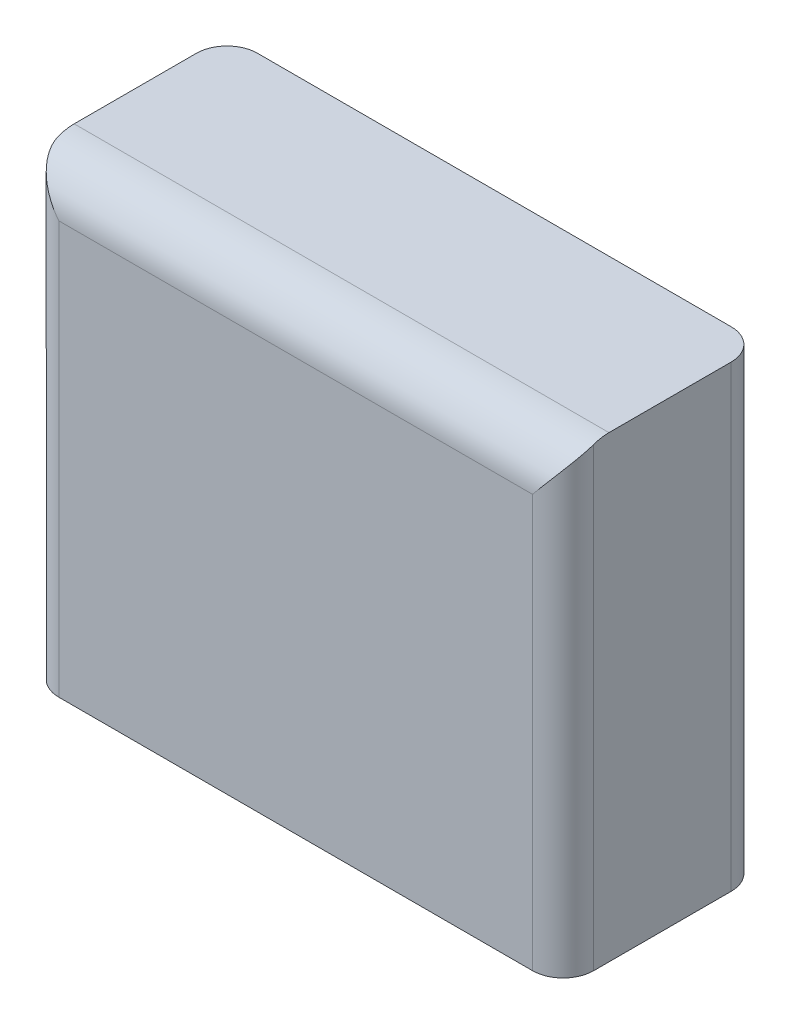
ISO-10303-21;
HEADER;
FILE_DESCRIPTION(('STEP AP214'),'2;1');
FILE_NAME('part.step','',(''),(''),'','','');
FILE_SCHEMA(('AUTOMOTIVE_DESIGN { 1 0 10303 214 1 1 1 1 }'));
ENDSEC;
DATA;
#1=APPLICATION_CONTEXT('core data for automotive mechanical design processes');
#2=APPLICATION_PROTOCOL_DEFINITION('international standard','automotive_design',2000,#1);
#3=PRODUCT_CONTEXT('',#1,'mechanical');
#4=PRODUCT('Part','Part','',(#3));
#5=PRODUCT_RELATED_PRODUCT_CATEGORY('part','',(#4));
#6=PRODUCT_DEFINITION_FORMATION('','',#4);
#7=PRODUCT_DEFINITION_CONTEXT('part definition',#1,'design');
#8=PRODUCT_DEFINITION('design','',#6,#7);
#9=PRODUCT_DEFINITION_SHAPE('','',#8);
#10=(LENGTH_UNIT() NAMED_UNIT(*) SI_UNIT(.MILLI.,.METRE.));
#11=(NAMED_UNIT(*) PLANE_ANGLE_UNIT() SI_UNIT($,.RADIAN.));
#12=(NAMED_UNIT(*) SI_UNIT($,.STERADIAN.) SOLID_ANGLE_UNIT());
#13=UNCERTAINTY_MEASURE_WITH_UNIT(LENGTH_MEASURE(1.E-05),#10,'distance_accuracy_value','');
#14=(GEOMETRIC_REPRESENTATION_CONTEXT(3) GLOBAL_UNCERTAINTY_ASSIGNED_CONTEXT((#13)) GLOBAL_UNIT_ASSIGNED_CONTEXT((#10,
#11,#12)) REPRESENTATION_CONTEXT('',''));
#15=CARTESIAN_POINT('',(0.,0.,0.));
#16=DIRECTION('',(0.,0.,1.));
#17=DIRECTION('',(1.,0.,0.));
#18=AXIS2_PLACEMENT_3D('',#15,#16,#17);
#19=CARTESIAN_POINT('',(17.5,-30.,6.5));
#20=DIRECTION('',(1.,0.,0.));
#21=DIRECTION('',(0.,0.,-1.));
#22=AXIS2_PLACEMENT_3D('',#19,#20,#21);
#23=PLANE('',#22);
#24=DIRECTION('',(0.,0.,-1.));
#25=VECTOR('',#24,1.);
#26=CARTESIAN_POINT('',(17.5,0.,6.5));
#27=LINE('',#26,#25);
#28=CARTESIAN_POINT('',(17.5,0.,3.5));
#29=VERTEX_POINT('',#28);
#30=CARTESIAN_POINT('',(17.5,0.,-4.5));
#31=VERTEX_POINT('',#30);
#32=EDGE_CURVE('E153',#29,#31,#27,.T.);
#33=ORIENTED_EDGE('',*,*,#32,.F.);
#34=CARTESIAN_POINT('',(17.5,-3.,3.5));
#35=DIRECTION('',(1.,0.,0.));
#36=DIRECTION('',(0.,0.,-1.));
#37=AXIS2_PLACEMENT_3D('',#34,#35,#36);
#38=CIRCLE('',#37,3.);
#39=CARTESIAN_POINT('',(17.5,-0.171572875253809,4.5));
#40=VERTEX_POINT('',#39);
#41=EDGE_CURVE('E206',#29,#40,#38,.T.);
#42=ORIENTED_EDGE('',*,*,#41,.T.);
#43=DIRECTION('',(0.,1.,0.));
#44=VECTOR('',#43,1.);
#45=CARTESIAN_POINT('',(17.5,-30.,4.5));
#46=LINE('',#45,#44);
#47=CARTESIAN_POINT('',(17.5,-30.,4.5));
#48=VERTEX_POINT('',#47);
#49=EDGE_CURVE('E198',#40,#48,#46,.F.);
#50=ORIENTED_EDGE('',*,*,#49,.T.);
#51=DIRECTION('',(0.,0.,-1.));
#52=VECTOR('',#51,1.);
#53=CARTESIAN_POINT('',(17.5,-30.,6.5));
#54=LINE('',#53,#52);
#55=CARTESIAN_POINT('',(17.5,-30.,-4.5));
#56=VERTEX_POINT('',#55);
#57=EDGE_CURVE('E154',#48,#56,#54,.T.);
#58=ORIENTED_EDGE('',*,*,#57,.T.);
#59=DIRECTION('',(0.,1.,0.));
#60=VECTOR('',#59,1.);
#61=CARTESIAN_POINT('',(17.5,-30.,-4.5));
#62=LINE('',#61,#60);
#63=EDGE_CURVE('E200',#56,#31,#62,.T.);
#64=ORIENTED_EDGE('',*,*,#63,.T.);
#65=EDGE_LOOP('',(#33,#42,#50,#58,#64));
#66=FACE_BOUND('',#65,.T.);
#67=ADVANCED_FACE('F51',(#66),#23,.T.);
#68=CARTESIAN_POINT('',(-17.5,-30.,6.5));
#69=DIRECTION('',(0.,0.,1.));
#70=DIRECTION('',(1.,0.,0.));
#71=AXIS2_PLACEMENT_3D('',#68,#69,#70);
#72=PLANE('',#71);
#73=DIRECTION('',(0.,1.,0.));
#74=VECTOR('',#73,1.);
#75=CARTESIAN_POINT('',(15.5,-30.,6.5));
#76=LINE('',#75,#74);
#77=CARTESIAN_POINT('',(15.5,-30.,6.5));
#78=VERTEX_POINT('',#77);
#79=CARTESIAN_POINT('',(15.5,-3.,6.5));
#80=VERTEX_POINT('',#79);
#81=EDGE_CURVE('E194',#78,#80,#76,.T.);
#82=ORIENTED_EDGE('',*,*,#81,.T.);
#83=DIRECTION('',(1.,0.,0.));
#84=VECTOR('',#83,1.);
#85=CARTESIAN_POINT('',(-15.5,-3.,6.5));
#86=LINE('',#85,#84);
#87=CARTESIAN_POINT('',(-15.5,-3.,6.5));
#88=VERTEX_POINT('',#87);
#89=EDGE_CURVE('E74',#80,#88,#86,.F.);
#90=ORIENTED_EDGE('',*,*,#89,.T.);
#91=DIRECTION('',(0.,1.,0.));
#92=VECTOR('',#91,1.);
#93=CARTESIAN_POINT('',(-15.5,-30.,6.5));
#94=LINE('',#93,#92);
#95=CARTESIAN_POINT('',(-15.5,-30.,6.5));
#96=VERTEX_POINT('',#95);
#97=EDGE_CURVE('E196',#88,#96,#94,.F.);
#98=ORIENTED_EDGE('',*,*,#97,.T.);
#99=DIRECTION('',(1.,0.,0.));
#100=VECTOR('',#99,1.);
#101=CARTESIAN_POINT('',(-17.5,-30.,6.5));
#102=LINE('',#101,#100);
#103=EDGE_CURVE('E164',#96,#78,#102,.T.);
#104=ORIENTED_EDGE('',*,*,#103,.T.);
#105=EDGE_LOOP('',(#82,#90,#98,#104));
#106=FACE_BOUND('',#105,.T.);
#107=ADVANCED_FACE('F238',(#106),#72,.T.);
#108=CARTESIAN_POINT('',(-17.5,-30.,6.5));
#109=DIRECTION('',(-1.,0.,0.));
#110=DIRECTION('',(0.,0.,1.));
#111=AXIS2_PLACEMENT_3D('',#108,#109,#110);
#112=PLANE('',#111);
#113=DIRECTION('',(0.,1.,0.));
#114=VECTOR('',#113,1.);
#115=CARTESIAN_POINT('',(-17.5,-30.,4.5));
#116=LINE('',#115,#114);
#117=CARTESIAN_POINT('',(-17.5,-30.,4.5));
#118=VERTEX_POINT('',#117);
#119=CARTESIAN_POINT('',(-17.5,-0.17157287525381,4.5));
#120=VERTEX_POINT('',#119);
#121=EDGE_CURVE('E182',#118,#120,#116,.T.);
#122=ORIENTED_EDGE('',*,*,#121,.T.);
#123=CARTESIAN_POINT('',(-17.5,-3.,3.5));
#124=DIRECTION('',(-1.,0.,0.));
#125=DIRECTION('',(0.,0.,1.));
#126=AXIS2_PLACEMENT_3D('',#123,#124,#125);
#127=CIRCLE('',#126,3.);
#128=CARTESIAN_POINT('',(-17.5,0.,3.5));
#129=VERTEX_POINT('',#128);
#130=EDGE_CURVE('E11',#120,#129,#127,.T.);
#131=ORIENTED_EDGE('',*,*,#130,.T.);
#132=DIRECTION('',(0.,0.,1.));
#133=VECTOR('',#132,1.);
#134=CARTESIAN_POINT('',(-17.5,0.,6.5));
#135=LINE('',#134,#133);
#136=CARTESIAN_POINT('',(-17.5,0.,-4.5));
#137=VERTEX_POINT('',#136);
#138=EDGE_CURVE('E158',#137,#129,#135,.T.);
#139=ORIENTED_EDGE('',*,*,#138,.F.);
#140=DIRECTION('',(0.,1.,0.));
#141=VECTOR('',#140,1.);
#142=CARTESIAN_POINT('',(-17.5,-30.,-4.5));
#143=LINE('',#142,#141);
#144=CARTESIAN_POINT('',(-17.5,-30.,-4.5));
#145=VERTEX_POINT('',#144);
#146=EDGE_CURVE('E184',#137,#145,#143,.F.);
#147=ORIENTED_EDGE('',*,*,#146,.T.);
#148=DIRECTION('',(0.,0.,1.));
#149=VECTOR('',#148,1.);
#150=CARTESIAN_POINT('',(-17.5,-30.,6.5));
#151=LINE('',#150,#149);
#152=EDGE_CURVE('E161',#145,#118,#151,.T.);
#153=ORIENTED_EDGE('',*,*,#152,.T.);
#154=EDGE_LOOP('',(#122,#131,#139,#147,#153));
#155=FACE_BOUND('',#154,.T.);
#156=ADVANCED_FACE('F244',(#155),#112,.T.);
#157=CARTESIAN_POINT('',(-17.5,-30.,-6.5));
#158=DIRECTION('',(0.,0.,-1.));
#159=DIRECTION('',(-1.,0.,0.));
#160=AXIS2_PLACEMENT_3D('',#157,#158,#159);
#161=PLANE('',#160);
#162=DIRECTION('',(-1.,0.,0.));
#163=VECTOR('',#162,1.);
#164=CARTESIAN_POINT('',(-17.5,-30.,-6.5));
#165=LINE('',#164,#163);
#166=CARTESIAN_POINT('',(15.5,-30.,-6.5));
#167=VERTEX_POINT('',#166);
#168=CARTESIAN_POINT('',(-15.5,-30.,-6.5));
#169=VERTEX_POINT('',#168);
#170=EDGE_CURVE('E157',#167,#169,#165,.T.);
#171=ORIENTED_EDGE('',*,*,#170,.T.);
#172=DIRECTION('',(0.,1.,0.));
#173=VECTOR('',#172,1.);
#174=CARTESIAN_POINT('',(-15.5,-30.,-6.5));
#175=LINE('',#174,#173);
#176=CARTESIAN_POINT('',(-15.5,0.,-6.5));
#177=VERTEX_POINT('',#176);
#178=EDGE_CURVE('E175',#169,#177,#175,.T.);
#179=ORIENTED_EDGE('',*,*,#178,.T.);
#180=DIRECTION('',(-1.,0.,0.));
#181=VECTOR('',#180,1.);
#182=CARTESIAN_POINT('',(-17.5,0.,-6.5));
#183=LINE('',#182,#181);
#184=CARTESIAN_POINT('',(15.5,0.,-6.5));
#185=VERTEX_POINT('',#184);
#186=EDGE_CURVE('E169',#185,#177,#183,.T.);
#187=ORIENTED_EDGE('',*,*,#186,.F.);
#188=DIRECTION('',(0.,1.,0.));
#189=VECTOR('',#188,1.);
#190=CARTESIAN_POINT('',(15.5,-30.,-6.5));
#191=LINE('',#190,#189);
#192=EDGE_CURVE('E167',#185,#167,#191,.F.);
#193=ORIENTED_EDGE('',*,*,#192,.T.);
#194=EDGE_LOOP('',(#171,#179,#187,#193));
#195=FACE_BOUND('',#194,.T.);
#196=ADVANCED_FACE('F240',(#195),#161,.T.);
#197=CARTESIAN_POINT('',(0.,-30.,0.));
#198=DIRECTION('',(0.,-1.,0.));
#199=DIRECTION('',(0.,0.,-1.));
#200=AXIS2_PLACEMENT_3D('',#197,#198,#199);
#201=PLANE('',#200);
#202=CARTESIAN_POINT('',(9.99999999999999,-30.,0.));
#203=DIRECTION('',(0.,-1.,0.));
#204=DIRECTION('',(0.,0.,-1.));
#205=AXIS2_PLACEMENT_3D('',#202,#203,#204);
#206=CIRCLE('',#205,3.025);
#207=CARTESIAN_POINT('',(9.99999999999999,-30.,-3.025));
#208=VERTEX_POINT('',#207);
#209=EDGE_CURVE('E144',#208,#208,#206,.T.);
#210=ORIENTED_EDGE('',*,*,#209,.F.);
#211=EDGE_LOOP('',(#210));
#212=FACE_BOUND('',#211,.T.);
#213=CARTESIAN_POINT('',(-10.,-30.,0.));
#214=DIRECTION('',(0.,-1.,0.));
#215=DIRECTION('',(0.,0.,-1.));
#216=AXIS2_PLACEMENT_3D('',#213,#214,#215);
#217=CIRCLE('',#216,3.025);
#218=CARTESIAN_POINT('',(-10.,-30.,-3.025));
#219=VERTEX_POINT('',#218);
#220=EDGE_CURVE('E137',#219,#219,#217,.T.);
#221=ORIENTED_EDGE('',*,*,#220,.F.);
#222=EDGE_LOOP('',(#221));
#223=FACE_BOUND('',#222,.T.);
#224=ORIENTED_EDGE('',*,*,#152,.F.);
#225=CARTESIAN_POINT('',(-15.5,-30.,-4.5));
#226=DIRECTION('',(0.,-1.,0.));
#227=DIRECTION('',(0.,0.,-1.));
#228=AXIS2_PLACEMENT_3D('',#225,#226,#227);
#229=CIRCLE('',#228,2.);
#230=EDGE_CURVE('E192',#145,#169,#229,.T.);
#231=ORIENTED_EDGE('',*,*,#230,.T.);
#232=ORIENTED_EDGE('',*,*,#170,.F.);
#233=CARTESIAN_POINT('',(15.5,-30.,-4.5));
#234=DIRECTION('',(0.,-1.,0.));
#235=DIRECTION('',(0.,0.,-1.));
#236=AXIS2_PLACEMENT_3D('',#233,#234,#235);
#237=CIRCLE('',#236,2.);
#238=EDGE_CURVE('E188',#167,#56,#237,.T.);
#239=ORIENTED_EDGE('',*,*,#238,.T.);
#240=ORIENTED_EDGE('',*,*,#57,.F.);
#241=CARTESIAN_POINT('',(15.5,-30.,4.5));
#242=DIRECTION('',(0.,-1.,0.));
#243=DIRECTION('',(0.,0.,-1.));
#244=AXIS2_PLACEMENT_3D('',#241,#242,#243);
#245=CIRCLE('',#244,2.);
#246=EDGE_CURVE('E186',#48,#78,#245,.T.);
#247=ORIENTED_EDGE('',*,*,#246,.T.);
#248=ORIENTED_EDGE('',*,*,#103,.F.);
#249=CARTESIAN_POINT('',(-15.5,-30.,4.5));
#250=DIRECTION('',(0.,-1.,0.));
#251=DIRECTION('',(0.,0.,-1.));
#252=AXIS2_PLACEMENT_3D('',#249,#250,#251);
#253=CIRCLE('',#252,2.);
#254=EDGE_CURVE('E190',#96,#118,#253,.T.);
#255=ORIENTED_EDGE('',*,*,#254,.T.);
#256=EDGE_LOOP('',(#224,#231,#232,#239,#240,#247,#248,#255));
#257=FACE_BOUND('',#256,.T.);
#258=ADVANCED_FACE('F243',(#212,#223,#257),#201,.T.);
#259=CARTESIAN_POINT('',(0.,0.,0.));
#260=DIRECTION('',(0.,-1.,0.));
#261=DIRECTION('',(0.,0.,-1.));
#262=AXIS2_PLACEMENT_3D('',#259,#260,#261);
#263=PLANE('',#262);
#264=ORIENTED_EDGE('',*,*,#138,.T.);
#265=DIRECTION('',(1.,0.,0.));
#266=VECTOR('',#265,1.);
#267=CARTESIAN_POINT('',(15.5,0.,3.5));
#268=LINE('',#267,#266);
#269=EDGE_CURVE('E203',#129,#29,#268,.T.);
#270=ORIENTED_EDGE('',*,*,#269,.T.);
#271=ORIENTED_EDGE('',*,*,#32,.T.);
#272=CARTESIAN_POINT('',(15.5,0.,-4.5));
#273=DIRECTION('',(0.,-1.,0.));
#274=DIRECTION('',(0.,0.,-1.));
#275=AXIS2_PLACEMENT_3D('',#272,#273,#274);
#276=CIRCLE('',#275,2.);
#277=EDGE_CURVE('E178',#31,#185,#276,.F.);
#278=ORIENTED_EDGE('',*,*,#277,.T.);
#279=ORIENTED_EDGE('',*,*,#186,.T.);
#280=CARTESIAN_POINT('',(-15.5,0.,-4.5));
#281=DIRECTION('',(0.,-1.,0.));
#282=DIRECTION('',(0.,0.,-1.));
#283=AXIS2_PLACEMENT_3D('',#280,#281,#282);
#284=CIRCLE('',#283,2.);
#285=EDGE_CURVE('E180',#177,#137,#284,.F.);
#286=ORIENTED_EDGE('',*,*,#285,.T.);
#287=EDGE_LOOP('',(#264,#270,#271,#278,#279,#286));
#288=FACE_BOUND('',#287,.T.);
#289=ADVANCED_FACE('F234',(#288),#263,.F.);
#290=CARTESIAN_POINT('',(-15.5,-30.,-4.5));
#291=DIRECTION('',(0.,1.,0.));
#292=DIRECTION('',(0.,0.,1.));
#293=AXIS2_PLACEMENT_3D('',#290,#291,#292);
#294=CYLINDRICAL_SURFACE('',#293,2.);
#295=ORIENTED_EDGE('',*,*,#230,.F.);
#296=ORIENTED_EDGE('',*,*,#146,.F.);
#297=ORIENTED_EDGE('',*,*,#285,.F.);
#298=ORIENTED_EDGE('',*,*,#178,.F.);
#299=EDGE_LOOP('',(#295,#296,#297,#298));
#300=FACE_BOUND('',#299,.T.);
#301=ADVANCED_FACE('F227',(#300),#294,.T.);
#302=CARTESIAN_POINT('',(-15.5,-30.,4.5));
#303=DIRECTION('',(0.,1.,0.));
#304=DIRECTION('',(0.,0.,1.));
#305=AXIS2_PLACEMENT_3D('',#302,#303,#304);
#306=CYLINDRICAL_SURFACE('',#305,2.);
#307=ORIENTED_EDGE('',*,*,#97,.F.);
#308=CARTESIAN_POINT('',(-17.5,-0.171572875253809,4.5));
#309=CARTESIAN_POINT('',(-17.5000084449649,-0.19149294973119,4.55638405555257));
#310=CARTESIAN_POINT('',(-17.4976165290429,-0.213113026951954,4.61213090524145));
#311=CARTESIAN_POINT('',(-17.4884161031397,-0.259452787780402,4.72185097214105));
#312=CARTESIAN_POINT('',(-17.4816143557198,-0.28416767868531,4.77582677235699));
#313=CARTESIAN_POINT('',(-17.4640650089645,-0.336195675457498,4.88114703210529));
#314=CARTESIAN_POINT('',(-17.4533578782159,-0.363480077625333,4.93251253251163));
#315=CARTESIAN_POINT('',(-17.428383343086,-0.420570081191317,5.03293300898971));
#316=CARTESIAN_POINT('',(-17.4141142613294,-0.450376866033002,5.08198688350807));
#317=CARTESIAN_POINT('',(-17.3593269063569,-0.557235204806671,5.24710684622474));
#318=CARTESIAN_POINT('',(-17.3107991236013,-0.639990691269775,5.35695114231588));
#319=CARTESIAN_POINT('',(-17.199579870891,-0.815528183344871,5.56066196172696));
#320=CARTESIAN_POINT('',(-17.1368256750297,-0.908353613562808,5.65445439532711));
#321=CARTESIAN_POINT('',(-16.9749333169946,-1.13830760334613,5.85925720363039));
#322=CARTESIAN_POINT('',(-16.8711102120254,-1.2786858419373,5.96289727870954));
#323=CARTESIAN_POINT('',(-16.6512915720566,-1.56777829054138,6.14153331793483));
#324=CARTESIAN_POINT('',(-16.5352792281827,-1.71650387636297,6.2164890478937));
#325=CARTESIAN_POINT('',(-16.3432419274776,-1.95911372234941,6.31536669032298));
#326=CARTESIAN_POINT('',(-16.269505033522,-2.05147691559191,6.34775479636274));
#327=CARTESIAN_POINT('',(-16.1201250475232,-2.23748721104573,6.40310220476016));
#328=CARTESIAN_POINT('',(-16.0444813343816,-2.3311347269433,6.42605839166327));
#329=CARTESIAN_POINT('',(-15.8160659756589,-2.61289025053771,6.48105514873023));
#330=CARTESIAN_POINT('',(-15.6613491422737,-2.80238832588658,6.4994534063341));
#331=CARTESIAN_POINT('',(-15.504618731357,-2.99434323024007,6.49999599518123));
#332=CARTESIAN_POINT('',(-15.502309327745,-2.99717166041597,6.49999999478464));
#333=CARTESIAN_POINT('',(-15.5,-3.,6.5));
#334=B_SPLINE_CURVE_WITH_KNOTS('',3,(#308,#309,#310,#311,#312,#313,#314,#315,#316,#317,#318,
#319,#320,#321,#322,#323,#324,#325,#326,#327,#328,#329,#330,#331,#332,#333),.UNSPECIFIED.,.F.,
.F.,(4,2,2,2,2,2,2,2,2,2,2,2,4),(0.,0.179272158824226,0.358270048541719,0.535463494925256,
0.71274054225016,1.14766579663324,1.58454732757419,2.19039501983592,2.79708941843106,
3.16434808038176,3.53172795410127,4.2641894371729,4.2751438948957),.UNSPECIFIED.);
#335=EDGE_CURVE('E60',#88,#120,#334,.F.);
#336=ORIENTED_EDGE('',*,*,#335,.T.);
#337=ORIENTED_EDGE('',*,*,#121,.F.);
#338=ORIENTED_EDGE('',*,*,#254,.F.);
#339=EDGE_LOOP('',(#307,#336,#337,#338));
#340=FACE_BOUND('',#339,.T.);
#341=ADVANCED_FACE('F222',(#340),#306,.T.);
#342=CARTESIAN_POINT('',(15.5,-30.,-4.5));
#343=DIRECTION('',(0.,1.,0.));
#344=DIRECTION('',(0.,0.,1.));
#345=AXIS2_PLACEMENT_3D('',#342,#343,#344);
#346=CYLINDRICAL_SURFACE('',#345,2.);
#347=ORIENTED_EDGE('',*,*,#238,.F.);
#348=ORIENTED_EDGE('',*,*,#192,.F.);
#349=ORIENTED_EDGE('',*,*,#277,.F.);
#350=ORIENTED_EDGE('',*,*,#63,.F.);
#351=EDGE_LOOP('',(#347,#348,#349,#350));
#352=FACE_BOUND('',#351,.T.);
#353=ADVANCED_FACE('F218',(#352),#346,.T.);
#354=CARTESIAN_POINT('',(15.5,-30.,4.5));
#355=DIRECTION('',(0.,1.,0.));
#356=DIRECTION('',(0.,0.,1.));
#357=AXIS2_PLACEMENT_3D('',#354,#355,#356);
#358=CYLINDRICAL_SURFACE('',#357,2.);
#359=ORIENTED_EDGE('',*,*,#49,.F.);
#360=CARTESIAN_POINT('',(17.5,-0.171572875253809,4.5));
#361=CARTESIAN_POINT('',(17.5000084449649,-0.19149294973119,4.55638405555257));
#362=CARTESIAN_POINT('',(17.4976165290429,-0.213113026951954,4.61213090524145));
#363=CARTESIAN_POINT('',(17.4884161031397,-0.259452787780402,4.72185097214105));
#364=CARTESIAN_POINT('',(17.4816143557198,-0.284167678685309,4.77582677235699));
#365=CARTESIAN_POINT('',(17.4640650089645,-0.336195675457498,4.88114703210529));
#366=CARTESIAN_POINT('',(17.4533578782159,-0.363480077625333,4.93251253251163));
#367=CARTESIAN_POINT('',(17.428383343086,-0.420570081191317,5.03293300898971));
#368=CARTESIAN_POINT('',(17.4141142613294,-0.450376866033002,5.08198688350807));
#369=CARTESIAN_POINT('',(17.3593269063569,-0.55723520480667,5.24710684622474));
#370=CARTESIAN_POINT('',(17.3107991236012,-0.639990691269775,5.35695114231588));
#371=CARTESIAN_POINT('',(17.199579870891,-0.815528183344871,5.56066196172696));
#372=CARTESIAN_POINT('',(17.1368256750297,-0.908353613562807,5.65445439532711));
#373=CARTESIAN_POINT('',(16.9749333169946,-1.13830760334613,5.85925720363039));
#374=CARTESIAN_POINT('',(16.8711102120254,-1.27868584193729,5.96289727870954));
#375=CARTESIAN_POINT('',(16.6512915720566,-1.56777829054137,6.14153331793482));
#376=CARTESIAN_POINT('',(16.5352792281827,-1.71650387636297,6.2164890478937));
#377=CARTESIAN_POINT('',(16.3432419274776,-1.95911372234941,6.31536669032298));
#378=CARTESIAN_POINT('',(16.269505033522,-2.05147691559191,6.34775479636274));
#379=CARTESIAN_POINT('',(16.1201250475232,-2.23748721104572,6.40310220476016));
#380=CARTESIAN_POINT('',(16.0444813343815,-2.33113472694327,6.42605839166327));
#381=CARTESIAN_POINT('',(15.8160659756589,-2.61289025053775,6.48105514873023));
#382=CARTESIAN_POINT('',(15.661349142274,-2.80238832588681,6.4994534063341));
#383=CARTESIAN_POINT('',(15.504618731357,-2.99434323024008,6.49999599518123));
#384=CARTESIAN_POINT('',(15.502309327745,-2.99717166041597,6.49999999478464));
#385=CARTESIAN_POINT('',(15.5,-3.,6.5));
#386=B_SPLINE_CURVE_WITH_KNOTS('',3,(#360,#361,#362,#363,#364,#365,#366,#367,#368,#369,#370,
#371,#372,#373,#374,#375,#376,#377,#378,#379,#380,#381,#382,#383,#384,#385),.UNSPECIFIED.,.F.,
.F.,(4,2,2,2,2,2,2,2,2,2,2,2,4),(0.,0.179272158824226,0.358270048541718,0.535463494925256,
0.712740542250161,1.14766579663325,1.58454732757419,2.19039501983591,2.79708941843105,
3.16434808038176,3.53172795410126,4.2641894371729,4.2751438948957),.UNSPECIFIED.);
#387=EDGE_CURVE('E208',#40,#80,#386,.T.);
#388=ORIENTED_EDGE('',*,*,#387,.T.);
#389=ORIENTED_EDGE('',*,*,#81,.F.);
#390=ORIENTED_EDGE('',*,*,#246,.F.);
#391=EDGE_LOOP('',(#359,#388,#389,#390));
#392=FACE_BOUND('',#391,.T.);
#393=ADVANCED_FACE('F214',(#392),#358,.T.);
#394=CARTESIAN_POINT('',(0.,-3.,3.5));
#395=DIRECTION('',(-1.,0.,0.));
#396=DIRECTION('',(0.,0.,1.));
#397=AXIS2_PLACEMENT_3D('',#394,#395,#396);
#398=CYLINDRICAL_SURFACE('',#397,3.);
#399=ORIENTED_EDGE('',*,*,#335,.F.);
#400=ORIENTED_EDGE('',*,*,#89,.F.);
#401=ORIENTED_EDGE('',*,*,#387,.F.);
#402=ORIENTED_EDGE('',*,*,#41,.F.);
#403=ORIENTED_EDGE('',*,*,#269,.F.);
#404=ORIENTED_EDGE('',*,*,#130,.F.);
#405=EDGE_LOOP('',(#399,#400,#401,#402,#403,#404));
#406=FACE_BOUND('',#405,.T.);
#407=ADVANCED_FACE('F53',(#406),#398,.T.);
#408=CARTESIAN_POINT('',(-10.,-13.,0.));
#409=DIRECTION('',(0.,-1.,0.));
#410=DIRECTION('',(0.,0.,-1.));
#411=AXIS2_PLACEMENT_3D('',#408,#409,#410);
#412=CONICAL_SURFACE('',#411,2.49999999999999,1.02974425867665);
#413=CARTESIAN_POINT('',(-10.,-11.4978484524311,0.));
#414=VERTEX_POINT('',#413);
#415=VERTEX_LOOP('',#414);
#416=FACE_BOUND('',#415,.T.);
#417=CARTESIAN_POINT('',(-10.,-13.,0.));
#418=DIRECTION('',(0.,-1.,0.));
#419=DIRECTION('',(0.,0.,-1.));
#420=AXIS2_PLACEMENT_3D('',#417,#418,#419);
#421=CIRCLE('',#420,2.49999999999999);
#422=CARTESIAN_POINT('',(-10.,-13.,-2.49999999999999));
#423=VERTEX_POINT('',#422);
#424=EDGE_CURVE('E150',#423,#423,#421,.T.);
#425=ORIENTED_EDGE('',*,*,#424,.T.);
#426=EDGE_LOOP('',(#425));
#427=FACE_BOUND('',#426,.T.);
#428=ADVANCED_FACE('F257',(#416,#427),#412,.F.);
#429=CARTESIAN_POINT('',(-10.,-30.,0.));
#430=DIRECTION('',(0.,-1.,0.));
#431=DIRECTION('',(0.,0.,-1.));
#432=AXIS2_PLACEMENT_3D('',#429,#430,#431);
#433=CYLINDRICAL_SURFACE('',#432,2.49999999999999);
#434=ORIENTED_EDGE('',*,*,#424,.F.);
#435=EDGE_LOOP('',(#434));
#436=FACE_BOUND('',#435,.T.);
#437=CARTESIAN_POINT('',(-10.,-29.475,0.));
#438=DIRECTION('',(0.,-1.,0.));
#439=DIRECTION('',(0.,0.,-1.));
#440=AXIS2_PLACEMENT_3D('',#437,#438,#439);
#441=CIRCLE('',#440,2.5);
#442=CARTESIAN_POINT('',(-10.,-29.475,-2.5));
#443=VERTEX_POINT('',#442);
#444=EDGE_CURVE('E141',#443,#443,#441,.T.);
#445=ORIENTED_EDGE('',*,*,#444,.T.);
#446=EDGE_LOOP('',(#445));
#447=FACE_BOUND('',#446,.T.);
#448=ADVANCED_FACE('F260',(#436,#447),#433,.F.);
#449=CARTESIAN_POINT('',(-10.,-30.,0.));
#450=DIRECTION('',(0.,-1.,0.));
#451=DIRECTION('',(0.,0.,-1.));
#452=AXIS2_PLACEMENT_3D('',#449,#450,#451);
#453=CONICAL_SURFACE('',#452,3.025,0.785398163397448);
#454=ORIENTED_EDGE('',*,*,#444,.F.);
#455=EDGE_LOOP('',(#454));
#456=FACE_BOUND('',#455,.T.);
#457=ORIENTED_EDGE('',*,*,#220,.T.);
#458=EDGE_LOOP('',(#457));
#459=FACE_BOUND('',#458,.T.);
#460=ADVANCED_FACE('F131',(#456,#459),#453,.F.);
#461=CARTESIAN_POINT('',(9.99999999999999,-13.,0.));
#462=DIRECTION('',(0.,-1.,0.));
#463=DIRECTION('',(0.,0.,-1.));
#464=AXIS2_PLACEMENT_3D('',#461,#462,#463);
#465=CONICAL_SURFACE('',#464,2.49999999999999,1.02974425867665);
#466=CARTESIAN_POINT('',(9.99999999999999,-11.4978484524311,0.));
#467=VERTEX_POINT('',#466);
#468=VERTEX_LOOP('',#467);
#469=FACE_BOUND('',#468,.T.);
#470=CARTESIAN_POINT('',(9.99999999999999,-13.,0.));
#471=DIRECTION('',(0.,-1.,0.));
#472=DIRECTION('',(0.,0.,-1.));
#473=AXIS2_PLACEMENT_3D('',#470,#471,#472);
#474=CIRCLE('',#473,2.49999999999999);
#475=CARTESIAN_POINT('',(9.99999999999999,-13.,-2.49999999999999));
#476=VERTEX_POINT('',#475);
#477=EDGE_CURVE('E135',#476,#476,#474,.T.);
#478=ORIENTED_EDGE('',*,*,#477,.T.);
#479=EDGE_LOOP('',(#478));
#480=FACE_BOUND('',#479,.T.);
#481=ADVANCED_FACE('F127',(#469,#480),#465,.F.);
#482=CARTESIAN_POINT('',(9.99999999999999,-30.,0.));
#483=DIRECTION('',(0.,-1.,0.));
#484=DIRECTION('',(0.,0.,-1.));
#485=AXIS2_PLACEMENT_3D('',#482,#483,#484);
#486=CYLINDRICAL_SURFACE('',#485,2.49999999999999);
#487=ORIENTED_EDGE('',*,*,#477,.F.);
#488=EDGE_LOOP('',(#487));
#489=FACE_BOUND('',#488,.T.);
#490=CARTESIAN_POINT('',(9.99999999999999,-29.475,0.));
#491=DIRECTION('',(0.,-1.,0.));
#492=DIRECTION('',(0.,0.,-1.));
#493=AXIS2_PLACEMENT_3D('',#490,#491,#492);
#494=CIRCLE('',#493,2.5);
#495=CARTESIAN_POINT('',(9.99999999999999,-29.475,-2.5));
#496=VERTEX_POINT('',#495);
#497=EDGE_CURVE('E138',#496,#496,#494,.T.);
#498=ORIENTED_EDGE('',*,*,#497,.T.);
#499=EDGE_LOOP('',(#498));
#500=FACE_BOUND('',#499,.T.);
#501=ADVANCED_FACE('F130',(#489,#500),#486,.F.);
#502=CARTESIAN_POINT('',(9.99999999999999,-30.,0.));
#503=DIRECTION('',(0.,-1.,0.));
#504=DIRECTION('',(0.,0.,-1.));
#505=AXIS2_PLACEMENT_3D('',#502,#503,#504);
#506=CONICAL_SURFACE('',#505,3.025,0.785398163397448);
#507=ORIENTED_EDGE('',*,*,#497,.F.);
#508=EDGE_LOOP('',(#507));
#509=FACE_BOUND('',#508,.T.);
#510=ORIENTED_EDGE('',*,*,#209,.T.);
#511=EDGE_LOOP('',(#510));
#512=FACE_BOUND('',#511,.T.);
#513=ADVANCED_FACE('F270',(#509,#512),#506,.F.);
#514=CLOSED_SHELL('',(#67,#107,#156,#196,#258,#289,#301,#341,#353,#393,#407,#428,#448,#460,#481,
#501,#513));
#515=MANIFOLD_SOLID_BREP('B2',#514);
#516=ADVANCED_BREP_SHAPE_REPRESENTATION('',(#18,#515),#14);
#517=SHAPE_DEFINITION_REPRESENTATION(#9,#516);
ENDSEC;
END-ISO-10303-21;
